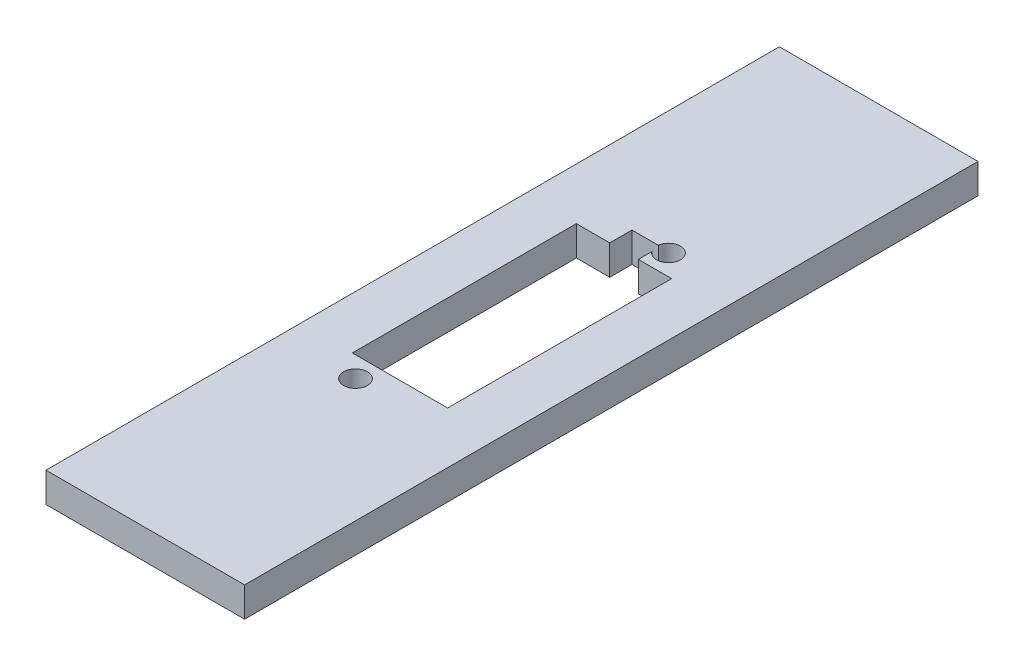
ISO-10303-21;
HEADER;
FILE_DESCRIPTION(('STEP AP214'),'2;1');
FILE_NAME('part.step','',(''),(''),'','','');
FILE_SCHEMA(('AUTOMOTIVE_DESIGN { 1 0 10303 214 1 1 1 1 }'));
ENDSEC;
DATA;
#1=APPLICATION_CONTEXT('core data for automotive mechanical design processes');
#2=APPLICATION_PROTOCOL_DEFINITION('international standard','automotive_design',2000,#1);
#3=PRODUCT_CONTEXT('',#1,'mechanical');
#4=PRODUCT('Part','Part','',(#3));
#5=PRODUCT_RELATED_PRODUCT_CATEGORY('part','',(#4));
#6=PRODUCT_DEFINITION_FORMATION('','',#4);
#7=PRODUCT_DEFINITION_CONTEXT('part definition',#1,'design');
#8=PRODUCT_DEFINITION('design','',#6,#7);
#9=PRODUCT_DEFINITION_SHAPE('','',#8);
#10=(LENGTH_UNIT() NAMED_UNIT(*) SI_UNIT(.MILLI.,.METRE.));
#11=(NAMED_UNIT(*) PLANE_ANGLE_UNIT() SI_UNIT($,.RADIAN.));
#12=(NAMED_UNIT(*) SI_UNIT($,.STERADIAN.) SOLID_ANGLE_UNIT());
#13=UNCERTAINTY_MEASURE_WITH_UNIT(LENGTH_MEASURE(1.E-05),#10,'distance_accuracy_value','');
#14=(GEOMETRIC_REPRESENTATION_CONTEXT(3) GLOBAL_UNCERTAINTY_ASSIGNED_CONTEXT((#13)) GLOBAL_UNIT_ASSIGNED_CONTEXT((#10,
#11,#12)) REPRESENTATION_CONTEXT('',''));
#15=CARTESIAN_POINT('',(0.,0.,0.));
#16=DIRECTION('',(0.,0.,1.));
#17=DIRECTION('',(1.,0.,0.));
#18=AXIS2_PLACEMENT_3D('',#15,#16,#17);
#19=CARTESIAN_POINT('',(-7.62,-38.9217188212443,-17.907));
#20=DIRECTION('',(0.,0.,-1.));
#21=DIRECTION('',(-1.,0.,0.));
#22=AXIS2_PLACEMENT_3D('',#19,#20,#21);
#23=PLANE('',#22);
#24=DIRECTION('',(0.,1.,0.));
#25=VECTOR('',#24,1.);
#26=CARTESIAN_POINT('',(2.286,-5.79209115950362,-17.907));
#27=LINE('',#26,#25);
#28=CARTESIAN_POINT('',(2.286,0.,-17.907));
#29=VERTEX_POINT('',#28);
#30=CARTESIAN_POINT('',(2.286,4.7625,-17.907));
#31=VERTEX_POINT('',#30);
#32=EDGE_CURVE('E170',#29,#31,#27,.T.);
#33=ORIENTED_EDGE('',*,*,#32,.F.);
#34=DIRECTION('',(1.,0.,0.));
#35=VECTOR('',#34,1.);
#36=CARTESIAN_POINT('',(-7.62,0.,-17.907));
#37=LINE('',#36,#35);
#38=CARTESIAN_POINT('',(7.62,0.,-17.907));
#39=VERTEX_POINT('',#38);
#40=EDGE_CURVE('E236',#29,#39,#37,.T.);
#41=ORIENTED_EDGE('',*,*,#40,.T.);
#42=DIRECTION('',(0.,1.,0.));
#43=VECTOR('',#42,1.);
#44=CARTESIAN_POINT('',(7.62,-38.9217188212443,-17.907));
#45=LINE('',#44,#43);
#46=CARTESIAN_POINT('',(7.62,4.7625,-17.907));
#47=VERTEX_POINT('',#46);
#48=EDGE_CURVE('E237',#39,#47,#45,.T.);
#49=ORIENTED_EDGE('',*,*,#48,.T.);
#50=DIRECTION('',(-1.,0.,0.));
#51=VECTOR('',#50,1.);
#52=CARTESIAN_POINT('',(-7.62,4.7625,-17.907));
#53=LINE('',#52,#51);
#54=EDGE_CURVE('E223',#47,#31,#53,.T.);
#55=ORIENTED_EDGE('',*,*,#54,.T.);
#56=EDGE_LOOP('',(#33,#41,#49,#55));
#57=FACE_BOUND('',#56,.T.);
#58=ADVANCED_FACE('F58',(#57),#23,.F.);
#59=CARTESIAN_POINT('',(15.875,4.7625,-58.6232));
#60=DIRECTION('',(-1.,0.,0.));
#61=DIRECTION('',(0.,0.,1.));
#62=AXIS2_PLACEMENT_3D('',#59,#60,#61);
#63=PLANE('',#62);
#64=DIRECTION('',(0.,0.,-1.));
#65=VECTOR('',#64,1.);
#66=CARTESIAN_POINT('',(15.875,0.,-58.6232));
#67=LINE('',#66,#65);
#68=CARTESIAN_POINT('',(15.875,0.,58.6232));
#69=VERTEX_POINT('',#68);
#70=CARTESIAN_POINT('',(15.875,0.,-58.6232));
#71=VERTEX_POINT('',#70);
#72=EDGE_CURVE('E215',#69,#71,#67,.T.);
#73=ORIENTED_EDGE('',*,*,#72,.T.);
#74=DIRECTION('',(0.,-1.,0.));
#75=VECTOR('',#74,1.);
#76=CARTESIAN_POINT('',(15.875,4.7625,-58.6232));
#77=LINE('',#76,#75);
#78=CARTESIAN_POINT('',(15.875,4.7625,-58.6232));
#79=VERTEX_POINT('',#78);
#80=EDGE_CURVE('E219',#79,#71,#77,.T.);
#81=ORIENTED_EDGE('',*,*,#80,.F.);
#82=DIRECTION('',(0.,0.,-1.));
#83=VECTOR('',#82,1.);
#84=CARTESIAN_POINT('',(15.875,4.7625,-58.6232));
#85=LINE('',#84,#83);
#86=CARTESIAN_POINT('',(15.875,4.7625,58.6232));
#87=VERTEX_POINT('',#86);
#88=EDGE_CURVE('E163',#87,#79,#85,.T.);
#89=ORIENTED_EDGE('',*,*,#88,.F.);
#90=DIRECTION('',(0.,-1.,0.));
#91=VECTOR('',#90,1.);
#92=CARTESIAN_POINT('',(15.875,4.7625,58.6232));
#93=LINE('',#92,#91);
#94=EDGE_CURVE('E212',#87,#69,#93,.T.);
#95=ORIENTED_EDGE('',*,*,#94,.T.);
#96=EDGE_LOOP('',(#73,#81,#89,#95));
#97=FACE_BOUND('',#96,.T.);
#98=ADVANCED_FACE('F296',(#97),#63,.F.);
#99=CARTESIAN_POINT('',(-15.875,4.7625,-58.6232));
#100=DIRECTION('',(0.,0.,1.));
#101=DIRECTION('',(1.,0.,0.));
#102=AXIS2_PLACEMENT_3D('',#99,#100,#101);
#103=PLANE('',#102);
#104=DIRECTION('',(-1.,0.,0.));
#105=VECTOR('',#104,1.);
#106=CARTESIAN_POINT('',(-15.875,0.,-58.6232));
#107=LINE('',#106,#105);
#108=CARTESIAN_POINT('',(-15.875,0.,-58.6232));
#109=VERTEX_POINT('',#108);
#110=EDGE_CURVE('E214',#71,#109,#107,.T.);
#111=ORIENTED_EDGE('',*,*,#110,.T.);
#112=DIRECTION('',(0.,-1.,0.));
#113=VECTOR('',#112,1.);
#114=CARTESIAN_POINT('',(-15.875,4.7625,-58.6232));
#115=LINE('',#114,#113);
#116=CARTESIAN_POINT('',(-15.875,4.7625,-58.6232));
#117=VERTEX_POINT('',#116);
#118=EDGE_CURVE('E207',#117,#109,#115,.T.);
#119=ORIENTED_EDGE('',*,*,#118,.F.);
#120=DIRECTION('',(-1.,0.,0.));
#121=VECTOR('',#120,1.);
#122=CARTESIAN_POINT('',(-15.875,4.7625,-58.6232));
#123=LINE('',#122,#121);
#124=EDGE_CURVE('E227',#79,#117,#123,.T.);
#125=ORIENTED_EDGE('',*,*,#124,.F.);
#126=ORIENTED_EDGE('',*,*,#80,.T.);
#127=EDGE_LOOP('',(#111,#119,#125,#126));
#128=FACE_BOUND('',#127,.T.);
#129=ADVANCED_FACE('F300',(#128),#103,.F.);
#130=CARTESIAN_POINT('',(-15.875,4.7625,-58.6232));
#131=DIRECTION('',(1.,0.,0.));
#132=DIRECTION('',(0.,0.,-1.));
#133=AXIS2_PLACEMENT_3D('',#130,#131,#132);
#134=PLANE('',#133);
#135=DIRECTION('',(0.,0.,1.));
#136=VECTOR('',#135,1.);
#137=CARTESIAN_POINT('',(-15.875,0.,-58.6232));
#138=LINE('',#137,#136);
#139=CARTESIAN_POINT('',(-15.875,0.,58.6232));
#140=VERTEX_POINT('',#139);
#141=EDGE_CURVE('E217',#109,#140,#138,.T.);
#142=ORIENTED_EDGE('',*,*,#141,.T.);
#143=DIRECTION('',(0.,-1.,0.));
#144=VECTOR('',#143,1.);
#145=CARTESIAN_POINT('',(-15.875,4.7625,58.6232));
#146=LINE('',#145,#144);
#147=CARTESIAN_POINT('',(-15.875,4.7625,58.6232));
#148=VERTEX_POINT('',#147);
#149=EDGE_CURVE('E199',#148,#140,#146,.T.);
#150=ORIENTED_EDGE('',*,*,#149,.F.);
#151=DIRECTION('',(0.,0.,1.));
#152=VECTOR('',#151,1.);
#153=CARTESIAN_POINT('',(-15.875,4.7625,-58.6232));
#154=LINE('',#153,#152);
#155=EDGE_CURVE('E225',#117,#148,#154,.T.);
#156=ORIENTED_EDGE('',*,*,#155,.F.);
#157=ORIENTED_EDGE('',*,*,#118,.T.);
#158=EDGE_LOOP('',(#142,#150,#156,#157));
#159=FACE_BOUND('',#158,.T.);
#160=ADVANCED_FACE('F381',(#159),#134,.F.);
#161=CARTESIAN_POINT('',(-15.875,4.7625,58.6232));
#162=DIRECTION('',(0.,0.,-1.));
#163=DIRECTION('',(-1.,0.,0.));
#164=AXIS2_PLACEMENT_3D('',#161,#162,#163);
#165=PLANE('',#164);
#166=DIRECTION('',(1.,0.,0.));
#167=VECTOR('',#166,1.);
#168=CARTESIAN_POINT('',(-15.875,0.,58.6232));
#169=LINE('',#168,#167);
#170=EDGE_CURVE('E201',#140,#69,#169,.T.);
#171=ORIENTED_EDGE('',*,*,#170,.T.);
#172=ORIENTED_EDGE('',*,*,#94,.F.);
#173=DIRECTION('',(1.,0.,0.));
#174=VECTOR('',#173,1.);
#175=CARTESIAN_POINT('',(-15.875,4.7625,58.6232));
#176=LINE('',#175,#174);
#177=EDGE_CURVE('E180',#148,#87,#176,.T.);
#178=ORIENTED_EDGE('',*,*,#177,.F.);
#179=ORIENTED_EDGE('',*,*,#149,.T.);
#180=EDGE_LOOP('',(#171,#172,#178,#179));
#181=FACE_BOUND('',#180,.T.);
#182=ADVANCED_FACE('F373',(#181),#165,.F.);
#183=CARTESIAN_POINT('',(0.,4.7625,0.));
#184=DIRECTION('',(0.,1.,0.));
#185=DIRECTION('',(0.,0.,1.));
#186=AXIS2_PLACEMENT_3D('',#183,#184,#185);
#187=PLANE('',#186);
#188=CARTESIAN_POINT('',(3.80999999999998,4.7625,-21.209));
#189=DIRECTION('',(0.,1.,0.));
#190=DIRECTION('',(0.,0.,1.));
#191=AXIS2_PLACEMENT_3D('',#188,#189,#190);
#192=CIRCLE('',#191,1.905);
#193=CARTESIAN_POINT('',(2.286,4.7625,-20.0659999999999));
#194=VERTEX_POINT('',#193);
#195=CARTESIAN_POINT('',(1.92200926909053,4.7625,-21.463));
#196=VERTEX_POINT('',#195);
#197=EDGE_CURVE('E12',#194,#196,#192,.T.);
#198=ORIENTED_EDGE('',*,*,#197,.F.);
#199=DIRECTION('',(0.,0.,1.));
#200=VECTOR('',#199,1.);
#201=CARTESIAN_POINT('',(2.286,4.7625,0.));
#202=LINE('',#201,#200);
#203=EDGE_CURVE('E164',#194,#31,#202,.T.);
#204=ORIENTED_EDGE('',*,*,#203,.T.);
#205=ORIENTED_EDGE('',*,*,#54,.F.);
#206=DIRECTION('',(0.,0.,-1.));
#207=VECTOR('',#206,1.);
#208=CARTESIAN_POINT('',(7.62,4.7625,-17.907));
#209=LINE('',#208,#207);
#210=CARTESIAN_POINT('',(7.62,4.7625,17.907));
#211=VERTEX_POINT('',#210);
#212=EDGE_CURVE('E250',#211,#47,#209,.T.);
#213=ORIENTED_EDGE('',*,*,#212,.F.);
#214=DIRECTION('',(1.,0.,0.));
#215=VECTOR('',#214,1.);
#216=CARTESIAN_POINT('',(-7.62,4.7625,17.907));
#217=LINE('',#216,#215);
#218=CARTESIAN_POINT('',(-7.62,4.7625,17.907));
#219=VERTEX_POINT('',#218);
#220=EDGE_CURVE('E246',#219,#211,#217,.T.);
#221=ORIENTED_EDGE('',*,*,#220,.F.);
#222=DIRECTION('',(0.,0.,1.));
#223=VECTOR('',#222,1.);
#224=CARTESIAN_POINT('',(-7.62,4.7625,-17.907));
#225=LINE('',#224,#223);
#226=CARTESIAN_POINT('',(-7.62,4.7625,-17.907));
#227=VERTEX_POINT('',#226);
#228=EDGE_CURVE('E235',#227,#219,#225,.T.);
#229=ORIENTED_EDGE('',*,*,#228,.F.);
#230=CARTESIAN_POINT('',(-2.286,4.7625,-17.907));
#231=VERTEX_POINT('',#230);
#232=EDGE_CURVE('E169',#231,#227,#53,.T.);
#233=ORIENTED_EDGE('',*,*,#232,.F.);
#234=DIRECTION('',(0.,0.,1.));
#235=VECTOR('',#234,1.);
#236=CARTESIAN_POINT('',(-2.286,4.7625,0.));
#237=LINE('',#236,#235);
#238=CARTESIAN_POINT('',(-2.286,4.7625,-21.463));
#239=VERTEX_POINT('',#238);
#240=EDGE_CURVE('E151',#239,#231,#237,.T.);
#241=ORIENTED_EDGE('',*,*,#240,.F.);
#242=DIRECTION('',(1.,0.,0.));
#243=VECTOR('',#242,1.);
#244=CARTESIAN_POINT('',(0.,4.7625,-21.463));
#245=LINE('',#244,#243);
#246=EDGE_CURVE('E159',#239,#196,#245,.T.);
#247=ORIENTED_EDGE('',*,*,#246,.T.);
#248=EDGE_LOOP('',(#198,#204,#205,#213,#221,#229,#233,#241,#247));
#249=FACE_BOUND('',#248,.T.);
#250=CARTESIAN_POINT('',(-3.81,4.7625,21.209));
#251=DIRECTION('',(0.,1.,0.));
#252=DIRECTION('',(0.,0.,1.));
#253=AXIS2_PLACEMENT_3D('',#250,#251,#252);
#254=CIRCLE('',#253,1.905);
#255=CARTESIAN_POINT('',(-3.81,4.7625,23.114));
#256=VERTEX_POINT('',#255);
#257=EDGE_CURVE('E184',#256,#256,#254,.T.);
#258=ORIENTED_EDGE('',*,*,#257,.F.);
#259=EDGE_LOOP('',(#258));
#260=FACE_BOUND('',#259,.T.);
#261=ORIENTED_EDGE('',*,*,#88,.T.);
#262=ORIENTED_EDGE('',*,*,#124,.T.);
#263=ORIENTED_EDGE('',*,*,#155,.T.);
#264=ORIENTED_EDGE('',*,*,#177,.T.);
#265=EDGE_LOOP('',(#261,#262,#263,#264));
#266=FACE_BOUND('',#265,.T.);
#267=ADVANCED_FACE('F60',(#249,#260,#266),#187,.T.);
#268=CARTESIAN_POINT('',(0.,0.,0.));
#269=DIRECTION('',(0.,1.,0.));
#270=DIRECTION('',(0.,0.,1.));
#271=AXIS2_PLACEMENT_3D('',#268,#269,#270);
#272=PLANE('',#271);
#273=CARTESIAN_POINT('',(-3.81,0.,21.209));
#274=DIRECTION('',(0.,1.,0.));
#275=DIRECTION('',(0.,0.,1.));
#276=AXIS2_PLACEMENT_3D('',#273,#274,#275);
#277=CIRCLE('',#276,1.905);
#278=CARTESIAN_POINT('',(-3.81,0.,23.114));
#279=VERTEX_POINT('',#278);
#280=EDGE_CURVE('E172',#279,#279,#277,.F.);
#281=ORIENTED_EDGE('',*,*,#280,.F.);
#282=EDGE_LOOP('',(#281));
#283=FACE_BOUND('',#282,.T.);
#284=DIRECTION('',(0.,0.,-1.));
#285=VECTOR('',#284,1.);
#286=CARTESIAN_POINT('',(2.286,0.,0.));
#287=LINE('',#286,#285);
#288=CARTESIAN_POINT('',(2.286,0.,-20.0659999999999));
#289=VERTEX_POINT('',#288);
#290=EDGE_CURVE('E176',#29,#289,#287,.T.);
#291=ORIENTED_EDGE('',*,*,#290,.T.);
#292=CARTESIAN_POINT('',(3.80999999999998,0.,-21.209));
#293=DIRECTION('',(0.,1.,0.));
#294=DIRECTION('',(0.,0.,1.));
#295=AXIS2_PLACEMENT_3D('',#292,#293,#294);
#296=CIRCLE('',#295,1.905);
#297=CARTESIAN_POINT('',(1.92200926909053,0.,-21.463));
#298=VERTEX_POINT('',#297);
#299=EDGE_CURVE('E187',#298,#289,#296,.F.);
#300=ORIENTED_EDGE('',*,*,#299,.F.);
#301=DIRECTION('',(-1.,0.,0.));
#302=VECTOR('',#301,1.);
#303=CARTESIAN_POINT('',(0.,0.,-21.463));
#304=LINE('',#303,#302);
#305=CARTESIAN_POINT('',(-2.286,0.,-21.463));
#306=VERTEX_POINT('',#305);
#307=EDGE_CURVE('E179',#298,#306,#304,.T.);
#308=ORIENTED_EDGE('',*,*,#307,.T.);
#309=DIRECTION('',(0.,0.,-1.));
#310=VECTOR('',#309,1.);
#311=CARTESIAN_POINT('',(-2.286,0.,0.));
#312=LINE('',#311,#310);
#313=CARTESIAN_POINT('',(-2.286,0.,-17.907));
#314=VERTEX_POINT('',#313);
#315=EDGE_CURVE('E154',#314,#306,#312,.T.);
#316=ORIENTED_EDGE('',*,*,#315,.F.);
#317=CARTESIAN_POINT('',(-7.62,0.,-17.907));
#318=VERTEX_POINT('',#317);
#319=EDGE_CURVE('E231',#318,#314,#37,.T.);
#320=ORIENTED_EDGE('',*,*,#319,.F.);
#321=DIRECTION('',(0.,0.,-1.));
#322=VECTOR('',#321,1.);
#323=CARTESIAN_POINT('',(-7.62,0.,-17.907));
#324=LINE('',#323,#322);
#325=CARTESIAN_POINT('',(-7.62,0.,17.907));
#326=VERTEX_POINT('',#325);
#327=EDGE_CURVE('E243',#326,#318,#324,.T.);
#328=ORIENTED_EDGE('',*,*,#327,.F.);
#329=DIRECTION('',(-1.,0.,0.));
#330=VECTOR('',#329,1.);
#331=CARTESIAN_POINT('',(-7.62,0.,17.907));
#332=LINE('',#331,#330);
#333=CARTESIAN_POINT('',(7.62,0.,17.907));
#334=VERTEX_POINT('',#333);
#335=EDGE_CURVE('E247',#334,#326,#332,.T.);
#336=ORIENTED_EDGE('',*,*,#335,.F.);
#337=DIRECTION('',(0.,0.,1.));
#338=VECTOR('',#337,1.);
#339=CARTESIAN_POINT('',(7.62,0.,-17.907));
#340=LINE('',#339,#338);
#341=EDGE_CURVE('E251',#39,#334,#340,.T.);
#342=ORIENTED_EDGE('',*,*,#341,.F.);
#343=ORIENTED_EDGE('',*,*,#40,.F.);
#344=EDGE_LOOP('',(#291,#300,#308,#316,#320,#328,#336,#342,#343));
#345=FACE_BOUND('',#344,.T.);
#346=ORIENTED_EDGE('',*,*,#72,.F.);
#347=ORIENTED_EDGE('',*,*,#170,.F.);
#348=ORIENTED_EDGE('',*,*,#141,.F.);
#349=ORIENTED_EDGE('',*,*,#110,.F.);
#350=EDGE_LOOP('',(#346,#347,#348,#349));
#351=FACE_BOUND('',#350,.T.);
#352=ADVANCED_FACE('F277',(#283,#345,#351),#272,.F.);
#353=CARTESIAN_POINT('',(7.62,-38.9217188212443,-17.907));
#354=DIRECTION('',(1.,0.,0.));
#355=DIRECTION('',(0.,0.,-1.));
#356=AXIS2_PLACEMENT_3D('',#353,#354,#355);
#357=PLANE('',#356);
#358=ORIENTED_EDGE('',*,*,#341,.T.);
#359=DIRECTION('',(0.,1.,0.));
#360=VECTOR('',#359,1.);
#361=CARTESIAN_POINT('',(7.62,-38.9217188212443,17.907));
#362=LINE('',#361,#360);
#363=EDGE_CURVE('E248',#334,#211,#362,.T.);
#364=ORIENTED_EDGE('',*,*,#363,.T.);
#365=ORIENTED_EDGE('',*,*,#212,.T.);
#366=ORIENTED_EDGE('',*,*,#48,.F.);
#367=EDGE_LOOP('',(#358,#364,#365,#366));
#368=FACE_BOUND('',#367,.T.);
#369=ADVANCED_FACE('F284',(#368),#357,.F.);
#370=CARTESIAN_POINT('',(-7.62,-38.9217188212443,17.907));
#371=DIRECTION('',(0.,0.,1.));
#372=DIRECTION('',(1.,0.,0.));
#373=AXIS2_PLACEMENT_3D('',#370,#371,#372);
#374=PLANE('',#373);
#375=ORIENTED_EDGE('',*,*,#335,.T.);
#376=DIRECTION('',(0.,1.,0.));
#377=VECTOR('',#376,1.);
#378=CARTESIAN_POINT('',(-7.62,-38.9217188212443,17.907));
#379=LINE('',#378,#377);
#380=EDGE_CURVE('E244',#326,#219,#379,.T.);
#381=ORIENTED_EDGE('',*,*,#380,.T.);
#382=ORIENTED_EDGE('',*,*,#220,.T.);
#383=ORIENTED_EDGE('',*,*,#363,.F.);
#384=EDGE_LOOP('',(#375,#381,#382,#383));
#385=FACE_BOUND('',#384,.T.);
#386=ADVANCED_FACE('F274',(#385),#374,.F.);
#387=CARTESIAN_POINT('',(-7.62,-38.9217188212443,-17.907));
#388=DIRECTION('',(-1.,0.,0.));
#389=DIRECTION('',(0.,0.,1.));
#390=AXIS2_PLACEMENT_3D('',#387,#388,#389);
#391=PLANE('',#390);
#392=ORIENTED_EDGE('',*,*,#327,.T.);
#393=DIRECTION('',(0.,1.,0.));
#394=VECTOR('',#393,1.);
#395=CARTESIAN_POINT('',(-7.62,-38.9217188212443,-17.907));
#396=LINE('',#395,#394);
#397=EDGE_CURVE('E240',#318,#227,#396,.T.);
#398=ORIENTED_EDGE('',*,*,#397,.T.);
#399=ORIENTED_EDGE('',*,*,#228,.T.);
#400=ORIENTED_EDGE('',*,*,#380,.F.);
#401=EDGE_LOOP('',(#392,#398,#399,#400));
#402=FACE_BOUND('',#401,.T.);
#403=ADVANCED_FACE('F266',(#402),#391,.F.);
#404=ORIENTED_EDGE('',*,*,#319,.T.);
#405=DIRECTION('',(0.,1.,0.));
#406=VECTOR('',#405,1.);
#407=CARTESIAN_POINT('',(-2.286,-5.79209115950362,-17.907));
#408=LINE('',#407,#406);
#409=EDGE_CURVE('E234',#314,#231,#408,.T.);
#410=ORIENTED_EDGE('',*,*,#409,.T.);
#411=ORIENTED_EDGE('',*,*,#232,.T.);
#412=ORIENTED_EDGE('',*,*,#397,.F.);
#413=EDGE_LOOP('',(#404,#410,#411,#412));
#414=FACE_BOUND('',#413,.T.);
#415=ADVANCED_FACE('F264',(#414),#23,.F.);
#416=CARTESIAN_POINT('',(0.,-5.79209115950362,-21.463));
#417=DIRECTION('',(0.,0.,1.));
#418=DIRECTION('',(1.,0.,0.));
#419=AXIS2_PLACEMENT_3D('',#416,#417,#418);
#420=PLANE('',#419);
#421=DIRECTION('',(0.,1.,0.));
#422=VECTOR('',#421,1.);
#423=CARTESIAN_POINT('',(1.92200926909053,-5.79209115950362,-21.463));
#424=LINE('',#423,#422);
#425=EDGE_CURVE('E62',#298,#196,#424,.T.);
#426=ORIENTED_EDGE('',*,*,#425,.T.);
#427=ORIENTED_EDGE('',*,*,#246,.F.);
#428=DIRECTION('',(0.,1.,0.));
#429=VECTOR('',#428,1.);
#430=CARTESIAN_POINT('',(-2.286,-5.79209115950362,-21.463));
#431=LINE('',#430,#429);
#432=EDGE_CURVE('E147',#306,#239,#431,.T.);
#433=ORIENTED_EDGE('',*,*,#432,.F.);
#434=ORIENTED_EDGE('',*,*,#307,.F.);
#435=EDGE_LOOP('',(#426,#427,#433,#434));
#436=FACE_BOUND('',#435,.T.);
#437=ADVANCED_FACE('F160',(#436),#420,.T.);
#438=CARTESIAN_POINT('',(-2.286,-5.79209115950362,0.));
#439=DIRECTION('',(-1.,0.,0.));
#440=DIRECTION('',(0.,0.,1.));
#441=AXIS2_PLACEMENT_3D('',#438,#439,#440);
#442=PLANE('',#441);
#443=ORIENTED_EDGE('',*,*,#315,.T.);
#444=ORIENTED_EDGE('',*,*,#432,.T.);
#445=ORIENTED_EDGE('',*,*,#240,.T.);
#446=ORIENTED_EDGE('',*,*,#409,.F.);
#447=EDGE_LOOP('',(#443,#444,#445,#446));
#448=FACE_BOUND('',#447,.T.);
#449=ADVANCED_FACE('F149',(#448),#442,.F.);
#450=CARTESIAN_POINT('',(2.286,-5.79209115950362,0.));
#451=DIRECTION('',(-1.,0.,0.));
#452=DIRECTION('',(0.,0.,1.));
#453=AXIS2_PLACEMENT_3D('',#450,#451,#452);
#454=PLANE('',#453);
#455=ORIENTED_EDGE('',*,*,#32,.T.);
#456=ORIENTED_EDGE('',*,*,#203,.F.);
#457=DIRECTION('',(0.,1.,0.));
#458=VECTOR('',#457,1.);
#459=CARTESIAN_POINT('',(2.286,-5.79209115950362,-20.0659999999999));
#460=LINE('',#459,#458);
#461=EDGE_CURVE('E68',#289,#194,#460,.T.);
#462=ORIENTED_EDGE('',*,*,#461,.F.);
#463=ORIENTED_EDGE('',*,*,#290,.F.);
#464=EDGE_LOOP('',(#455,#456,#462,#463));
#465=FACE_BOUND('',#464,.T.);
#466=ADVANCED_FACE('F195',(#465),#454,.T.);
#467=CARTESIAN_POINT('',(-3.81,-5.79209115950362,21.209));
#468=DIRECTION('',(0.,1.,0.));
#469=DIRECTION('',(0.,0.,1.));
#470=AXIS2_PLACEMENT_3D('',#467,#468,#469);
#471=CYLINDRICAL_SURFACE('',#470,1.905);
#472=ORIENTED_EDGE('',*,*,#280,.T.);
#473=EDGE_LOOP('',(#472));
#474=FACE_BOUND('',#473,.T.);
#475=ORIENTED_EDGE('',*,*,#257,.T.);
#476=EDGE_LOOP('',(#475));
#477=FACE_BOUND('',#476,.T.);
#478=ADVANCED_FACE('F317',(#474,#477),#471,.F.);
#479=CARTESIAN_POINT('',(3.80999999999998,-5.79209115950362,-21.209));
#480=DIRECTION('',(0.,1.,0.));
#481=DIRECTION('',(0.,0.,1.));
#482=AXIS2_PLACEMENT_3D('',#479,#480,#481);
#483=CYLINDRICAL_SURFACE('',#482,1.905);
#484=ORIENTED_EDGE('',*,*,#299,.T.);
#485=ORIENTED_EDGE('',*,*,#461,.T.);
#486=ORIENTED_EDGE('',*,*,#197,.T.);
#487=ORIENTED_EDGE('',*,*,#425,.F.);
#488=EDGE_LOOP('',(#484,#485,#486,#487));
#489=FACE_BOUND('',#488,.T.);
#490=ADVANCED_FACE('F191',(#489),#483,.F.);
#491=CLOSED_SHELL('',(#58,#98,#129,#160,#182,#267,#352,#369,#386,#403,#415,#437,#449,#466,#478,#490));
#492=MANIFOLD_SOLID_BREP('B2',#491);
#493=ADVANCED_BREP_SHAPE_REPRESENTATION('',(#18,#492),#14);
#494=SHAPE_DEFINITION_REPRESENTATION(#9,#493);
ENDSEC;
END-ISO-10303-21;
